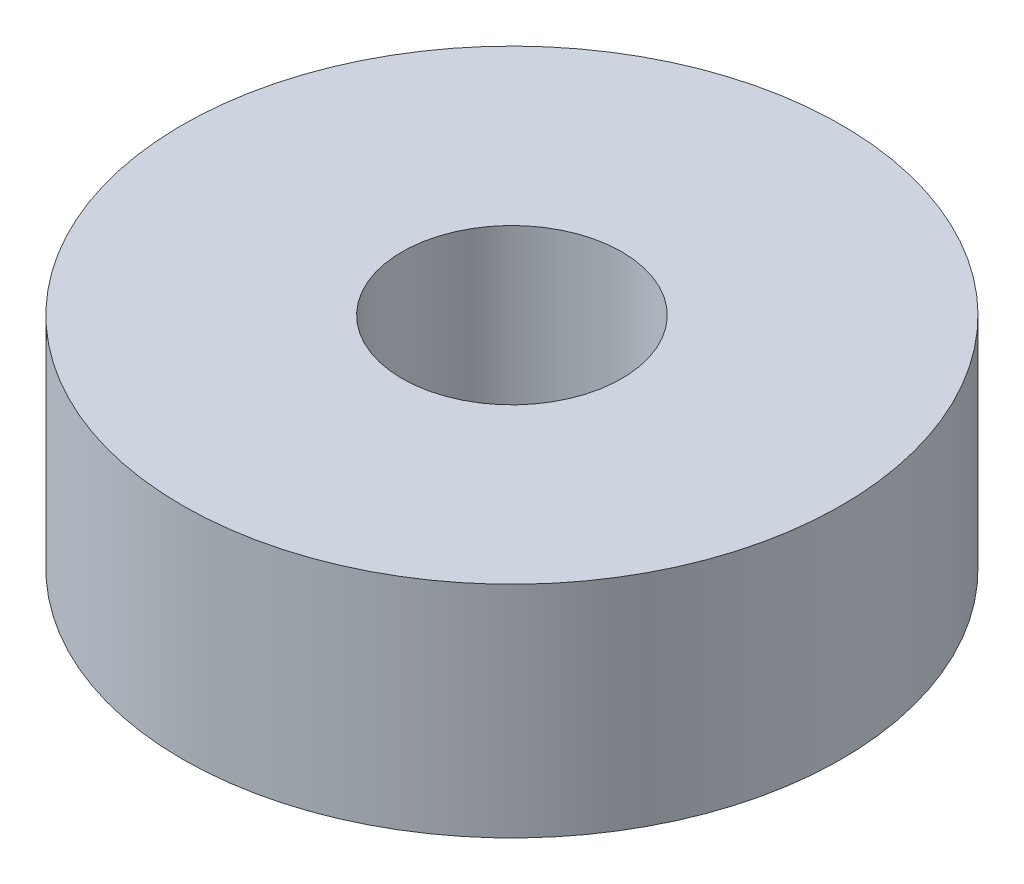
ISO-10303-21;
HEADER;
FILE_DESCRIPTION(('STEP AP214'),'2;1');
FILE_NAME('part.step','',(''),(''),'','','');
FILE_SCHEMA(('AUTOMOTIVE_DESIGN { 1 0 10303 214 1 1 1 1 }'));
ENDSEC;
DATA;
#1=APPLICATION_CONTEXT('core data for automotive mechanical design processes');
#2=APPLICATION_PROTOCOL_DEFINITION('international standard','automotive_design',2000,#1);
#3=PRODUCT_CONTEXT('',#1,'mechanical');
#4=PRODUCT('Part','Part','',(#3));
#5=PRODUCT_RELATED_PRODUCT_CATEGORY('part','',(#4));
#6=PRODUCT_DEFINITION_FORMATION('','',#4);
#7=PRODUCT_DEFINITION_CONTEXT('part definition',#1,'design');
#8=PRODUCT_DEFINITION('design','',#6,#7);
#9=PRODUCT_DEFINITION_SHAPE('','',#8);
#10=(LENGTH_UNIT() NAMED_UNIT(*) SI_UNIT(.MILLI.,.METRE.));
#11=(NAMED_UNIT(*) PLANE_ANGLE_UNIT() SI_UNIT($,.RADIAN.));
#12=(NAMED_UNIT(*) SI_UNIT($,.STERADIAN.) SOLID_ANGLE_UNIT());
#13=UNCERTAINTY_MEASURE_WITH_UNIT(LENGTH_MEASURE(1.E-05),#10,'distance_accuracy_value','');
#14=(GEOMETRIC_REPRESENTATION_CONTEXT(3) GLOBAL_UNCERTAINTY_ASSIGNED_CONTEXT((#13)) GLOBAL_UNIT_ASSIGNED_CONTEXT((#10,
#11,#12)) REPRESENTATION_CONTEXT('',''));
#15=CARTESIAN_POINT('',(0.,0.,0.));
#16=DIRECTION('',(0.,0.,1.));
#17=DIRECTION('',(1.,0.,0.));
#18=AXIS2_PLACEMENT_3D('',#15,#16,#17);
#19=CARTESIAN_POINT('',(0.,10.,0.));
#20=DIRECTION('',(0.,1.,0.));
#21=DIRECTION('',(0.,0.,1.));
#22=AXIS2_PLACEMENT_3D('',#19,#20,#21);
#23=PLANE('',#22);
#24=CARTESIAN_POINT('',(0.,10.,0.));
#25=DIRECTION('',(0.,1.,0.));
#26=DIRECTION('',(0.,0.,1.));
#27=AXIS2_PLACEMENT_3D('',#24,#25,#26);
#28=CIRCLE('',#27,15.);
#29=CARTESIAN_POINT('',(0.,10.,15.));
#30=VERTEX_POINT('',#29);
#31=EDGE_CURVE('E10',#30,#30,#28,.T.);
#32=ORIENTED_EDGE('',*,*,#31,.T.);
#33=EDGE_LOOP('',(#32));
#34=FACE_BOUND('',#33,.T.);
#35=CARTESIAN_POINT('',(0.,10.,0.));
#36=DIRECTION('',(0.,1.,0.));
#37=DIRECTION('',(0.,0.,1.));
#38=AXIS2_PLACEMENT_3D('',#35,#36,#37);
#39=CIRCLE('',#38,5.);
#40=CARTESIAN_POINT('',(0.,10.,5.));
#41=VERTEX_POINT('',#40);
#42=EDGE_CURVE('E50',#41,#41,#39,.T.);
#43=ORIENTED_EDGE('',*,*,#42,.F.);
#44=EDGE_LOOP('',(#43));
#45=FACE_BOUND('',#44,.T.);
#46=ADVANCED_FACE('F37',(#34,#45),#23,.T.);
#47=CARTESIAN_POINT('',(0.,0.,0.));
#48=DIRECTION('',(0.,1.,0.));
#49=DIRECTION('',(0.,0.,1.));
#50=AXIS2_PLACEMENT_3D('',#47,#48,#49);
#51=PLANE('',#50);
#52=CARTESIAN_POINT('',(0.,0.,0.));
#53=DIRECTION('',(0.,1.,0.));
#54=DIRECTION('',(0.,0.,1.));
#55=AXIS2_PLACEMENT_3D('',#52,#53,#54);
#56=CIRCLE('',#55,15.);
#57=CARTESIAN_POINT('',(0.,0.,15.));
#58=VERTEX_POINT('',#57);
#59=EDGE_CURVE('E41',#58,#58,#56,.T.);
#60=ORIENTED_EDGE('',*,*,#59,.F.);
#61=EDGE_LOOP('',(#60));
#62=FACE_BOUND('',#61,.T.);
#63=CARTESIAN_POINT('',(0.,0.,0.));
#64=DIRECTION('',(0.,1.,0.));
#65=DIRECTION('',(0.,0.,1.));
#66=AXIS2_PLACEMENT_3D('',#63,#64,#65);
#67=CIRCLE('',#66,5.);
#68=CARTESIAN_POINT('',(0.,0.,5.));
#69=VERTEX_POINT('',#68);
#70=EDGE_CURVE('E52',#69,#69,#67,.T.);
#71=ORIENTED_EDGE('',*,*,#70,.T.);
#72=EDGE_LOOP('',(#71));
#73=FACE_BOUND('',#72,.T.);
#74=ADVANCED_FACE('F64',(#62,#73),#51,.F.);
#75=CARTESIAN_POINT('',(0.,10.,0.));
#76=DIRECTION('',(0.,-1.,0.));
#77=DIRECTION('',(0.,0.,-1.));
#78=AXIS2_PLACEMENT_3D('',#75,#76,#77);
#79=CYLINDRICAL_SURFACE('',#78,15.);
#80=ORIENTED_EDGE('',*,*,#31,.F.);
#81=EDGE_LOOP('',(#80));
#82=FACE_BOUND('',#81,.T.);
#83=ORIENTED_EDGE('',*,*,#59,.T.);
#84=EDGE_LOOP('',(#83));
#85=FACE_BOUND('',#84,.T.);
#86=ADVANCED_FACE('F39',(#82,#85),#79,.T.);
#87=CARTESIAN_POINT('',(0.,10.,0.));
#88=DIRECTION('',(0.,-1.,0.));
#89=DIRECTION('',(0.,0.,-1.));
#90=AXIS2_PLACEMENT_3D('',#87,#88,#89);
#91=CYLINDRICAL_SURFACE('',#90,5.);
#92=ORIENTED_EDGE('',*,*,#42,.T.);
#93=EDGE_LOOP('',(#92));
#94=FACE_BOUND('',#93,.T.);
#95=ORIENTED_EDGE('',*,*,#70,.F.);
#96=EDGE_LOOP('',(#95));
#97=FACE_BOUND('',#96,.T.);
#98=ADVANCED_FACE('F60',(#94,#97),#91,.F.);
#99=CLOSED_SHELL('',(#46,#74,#86,#98));
#100=MANIFOLD_SOLID_BREP('B2',#99);
#101=ADVANCED_BREP_SHAPE_REPRESENTATION('',(#18,#100),#14);
#102=SHAPE_DEFINITION_REPRESENTATION(#9,#101);
ENDSEC;
END-ISO-10303-21;
